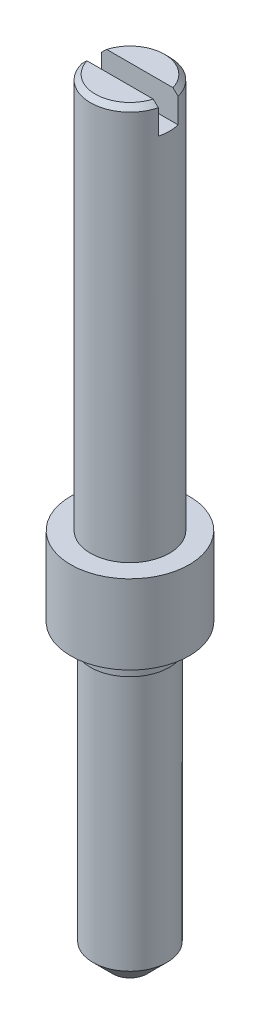
ISO-10303-21;
HEADER;
FILE_DESCRIPTION(('STEP AP214'),'2;1');
FILE_NAME('part.step','',(''),(''),'','','');
FILE_SCHEMA(('AUTOMOTIVE_DESIGN { 1 0 10303 214 1 1 1 1 }'));
ENDSEC;
DATA;
#1=APPLICATION_CONTEXT('core data for automotive mechanical design processes');
#2=APPLICATION_PROTOCOL_DEFINITION('international standard','automotive_design',2000,#1);
#3=PRODUCT_CONTEXT('',#1,'mechanical');
#4=PRODUCT('Part','Part','',(#3));
#5=PRODUCT_RELATED_PRODUCT_CATEGORY('part','',(#4));
#6=PRODUCT_DEFINITION_FORMATION('','',#4);
#7=PRODUCT_DEFINITION_CONTEXT('part definition',#1,'design');
#8=PRODUCT_DEFINITION('design','',#6,#7);
#9=PRODUCT_DEFINITION_SHAPE('','',#8);
#10=(LENGTH_UNIT() NAMED_UNIT(*) SI_UNIT(.MILLI.,.METRE.));
#11=(NAMED_UNIT(*) PLANE_ANGLE_UNIT() SI_UNIT($,.RADIAN.));
#12=(NAMED_UNIT(*) SI_UNIT($,.STERADIAN.) SOLID_ANGLE_UNIT());
#13=UNCERTAINTY_MEASURE_WITH_UNIT(LENGTH_MEASURE(1.E-05),#10,'distance_accuracy_value','');
#14=(GEOMETRIC_REPRESENTATION_CONTEXT(3) GLOBAL_UNCERTAINTY_ASSIGNED_CONTEXT((#13)) GLOBAL_UNIT_ASSIGNED_CONTEXT((#10,
#11,#12)) REPRESENTATION_CONTEXT('',''));
#15=CARTESIAN_POINT('',(0.,0.,0.));
#16=DIRECTION('',(0.,0.,1.));
#17=DIRECTION('',(1.,0.,0.));
#18=AXIS2_PLACEMENT_3D('',#15,#16,#17);
#19=CARTESIAN_POINT('',(0.,-1.,0.));
#20=DIRECTION('',(0.,-1.,0.));
#21=DIRECTION('',(0.,0.,-1.));
#22=AXIS2_PLACEMENT_3D('',#19,#20,#21);
#23=PLANE('',#22);
#24=CARTESIAN_POINT('',(0.,-1.,0.));
#25=DIRECTION('',(0.,-1.,0.));
#26=DIRECTION('',(0.,0.,-1.));
#27=AXIS2_PLACEMENT_3D('',#24,#25,#26);
#28=CIRCLE('',#27,2.);
#29=CARTESIAN_POINT('',(0.,-1.,-2.));
#30=VERTEX_POINT('',#29);
#31=EDGE_CURVE('E321',#30,#30,#28,.T.);
#32=ORIENTED_EDGE('',*,*,#31,.T.);
#33=EDGE_LOOP('',(#32));
#34=FACE_BOUND('',#33,.T.);
#35=CARTESIAN_POINT('',(0.,-1.,0.));
#36=DIRECTION('',(0.,-1.,0.));
#37=DIRECTION('',(0.,0.,-1.));
#38=AXIS2_PLACEMENT_3D('',#35,#36,#37);
#39=CIRCLE('',#38,1.875);
#40=CARTESIAN_POINT('',(0.,-1.,-1.875));
#41=VERTEX_POINT('',#40);
#42=EDGE_CURVE('E325',#41,#41,#39,.T.);
#43=ORIENTED_EDGE('',*,*,#42,.F.);
#44=EDGE_LOOP('',(#43));
#45=FACE_BOUND('',#44,.T.);
#46=ADVANCED_FACE('F34',(#34,#45),#23,.T.);
#47=CARTESIAN_POINT('',(0.,0.,0.));
#48=DIRECTION('',(0.,1.,0.));
#49=DIRECTION('',(0.,0.,1.));
#50=AXIS2_PLACEMENT_3D('',#47,#48,#49);
#51=PLANE('',#50);
#52=CARTESIAN_POINT('',(0.,0.,0.));
#53=DIRECTION('',(0.,1.,0.));
#54=DIRECTION('',(0.,0.,1.));
#55=AXIS2_PLACEMENT_3D('',#52,#53,#54);
#56=CIRCLE('',#55,3.);
#57=CARTESIAN_POINT('',(0.,0.,3.));
#58=VERTEX_POINT('',#57);
#59=EDGE_CURVE('E121',#58,#58,#56,.T.);
#60=ORIENTED_EDGE('',*,*,#59,.F.);
#61=EDGE_LOOP('',(#60));
#62=FACE_BOUND('',#61,.T.);
#63=CARTESIAN_POINT('',(0.,0.,0.));
#64=DIRECTION('',(0.,1.,0.));
#65=DIRECTION('',(0.,0.,1.));
#66=AXIS2_PLACEMENT_3D('',#63,#64,#65);
#67=CIRCLE('',#66,2.);
#68=CARTESIAN_POINT('',(0.,0.,2.));
#69=VERTEX_POINT('',#68);
#70=EDGE_CURVE('E304',#69,#69,#67,.F.);
#71=ORIENTED_EDGE('',*,*,#70,.F.);
#72=EDGE_LOOP('',(#71));
#73=FACE_BOUND('',#72,.T.);
#74=ADVANCED_FACE('F170',(#62,#73),#51,.F.);
#75=CARTESIAN_POINT('',(0.,24.,0.));
#76=DIRECTION('',(0.,1.,0.));
#77=DIRECTION('',(0.,0.,1.));
#78=AXIS2_PLACEMENT_3D('',#75,#76,#77);
#79=PLANE('',#78);
#80=DIRECTION('',(-1.,0.,0.));
#81=VECTOR('',#80,1.);
#82=CARTESIAN_POINT('',(-1.93649167310371,24.,-0.5));
#83=LINE('',#82,#81);
#84=CARTESIAN_POINT('',(1.67705098312484,24.,-0.5));
#85=VERTEX_POINT('',#84);
#86=CARTESIAN_POINT('',(-1.67705098312484,24.,-0.5));
#87=VERTEX_POINT('',#86);
#88=EDGE_CURVE('E104',#85,#87,#83,.T.);
#89=ORIENTED_EDGE('',*,*,#88,.F.);
#90=CARTESIAN_POINT('',(0.,24.,0.));
#91=DIRECTION('',(0.,1.,0.));
#92=DIRECTION('',(0.,0.,1.));
#93=AXIS2_PLACEMENT_3D('',#90,#91,#92);
#94=CIRCLE('',#93,1.75);
#95=EDGE_CURVE('E131',#85,#87,#94,.T.);
#96=ORIENTED_EDGE('',*,*,#95,.T.);
#97=EDGE_LOOP('',(#89,#96));
#98=FACE_BOUND('',#97,.T.);
#99=ADVANCED_FACE('F161',(#98),#79,.T.);
#100=CARTESIAN_POINT('',(0.,24.,0.));
#101=DIRECTION('',(0.,-1.,0.));
#102=DIRECTION('',(0.,0.,-1.));
#103=AXIS2_PLACEMENT_3D('',#100,#101,#102);
#104=CONICAL_SURFACE('',#103,1.75,0.785398163397452);
#105=CARTESIAN_POINT('',(4.26531787754271,21.4554759755608,-0.5));
#106=CARTESIAN_POINT('',(4.15151518624152,21.5685024584271,-0.5));
#107=CARTESIAN_POINT('',(4.03768402372244,21.6815002934528,-0.5));
#108=CARTESIAN_POINT('',(3.80991975587555,21.9074387740765,-0.5));
#109=CARTESIAN_POINT('',(3.69598663470435,22.0203794037019,-0.5));
#110=CARTESIAN_POINT('',(3.46754857933057,22.2466242081267,-0.5));
#111=CARTESIAN_POINT('',(3.3530432257615,22.359927959685,-0.5));
#112=CARTESIAN_POINT('',(3.12391530891066,22.5863714174036,-0.5));
#113=CARTESIAN_POINT('',(3.00929277333081,22.699511151607,-0.5));
#114=CARTESIAN_POINT('',(2.70997074398026,22.9944738741391,-0.5));
#115=CARTESIAN_POINT('',(2.52512281691123,23.1761465743836,-0.5));
#116=CARTESIAN_POINT('',(2.24709863471769,23.4480252609569,-0.5));
#117=CARTESIAN_POINT('',(2.15426369332282,23.5385801504923,-0.5));
#118=CARTESIAN_POINT('',(1.96826703440717,23.7193378604755,-0.5));
#119=CARTESIAN_POINT('',(1.87510534627139,23.8095407111157,-0.5));
#120=CARTESIAN_POINT('',(1.68864712306421,23.9890633836891,-0.5));
#121=CARTESIAN_POINT('',(1.59535259608439,24.0783852904116,-0.5));
#122=CARTESIAN_POINT('',(1.40793266669689,24.256220208321,-0.5));
#123=CARTESIAN_POINT('',(1.31380699992914,24.3447329424718,-0.5));
#124=CARTESIAN_POINT('',(1.17161181625573,24.4762812718874,-0.5));
#125=CARTESIAN_POINT('',(1.12407958973265,24.5198968574824,-0.5));
#126=CARTESIAN_POINT('',(1.02851175250693,24.6065721259345,-0.5));
#127=CARTESIAN_POINT('',(0.980476157653118,24.6496318261994,-0.5));
#128=CARTESIAN_POINT('',(0.883705860067149,24.7349073268237,-0.5));
#129=CARTESIAN_POINT('',(0.834971543685559,24.7771235648337,-0.5));
#130=CARTESIAN_POINT('',(0.73642483553698,24.8602743358567,-0.5));
#131=CARTESIAN_POINT('',(0.686612687192244,24.9012091532655,-0.5));
#132=CARTESIAN_POINT('',(0.617031379774116,24.9559000782556,-0.5));
#133=CARTESIAN_POINT('',(0.598008489381538,24.9706041090213,-0.5));
#134=CARTESIAN_POINT('',(0.5596648389008,24.9996222045299,-0.5));
#135=CARTESIAN_POINT('',(0.540344059316314,25.0139362435775,-0.5));
#136=CARTESIAN_POINT('',(0.501292890607584,25.0421082406535,-0.5));
#137=CARTESIAN_POINT('',(0.481561553810242,25.0559648932016,-0.5));
#138=CARTESIAN_POINT('',(0.441659654755156,25.0830290820533,-0.5));
#139=CARTESIAN_POINT('',(0.421489104550932,25.096236636138,-0.5));
#140=CARTESIAN_POINT('',(0.361591838721084,25.1337311733941,-0.5));
#141=CARTESIAN_POINT('',(0.321138914284564,25.1568871627387,-0.5));
#142=CARTESIAN_POINT('',(0.237575443534113,25.1976166146513,-0.5));
#143=CARTESIAN_POINT('',(0.194480378251023,25.2152194619088,-0.5));
#144=CARTESIAN_POINT('',(0.121079633871168,25.2362844237364,-0.5));
#145=CARTESIAN_POINT('',(0.0916123317298164,25.2425430717708,-0.5));
#146=CARTESIAN_POINT('',(0.0321049951851632,25.2498330261306,-0.5));
#147=CARTESIAN_POINT('',(0.00206744515655411,25.2508833375786,-0.5));
#148=CARTESIAN_POINT('',(-0.0576608042596576,25.247572541417,-0.5));
#149=CARTESIAN_POINT('',(-0.0873517863687083,25.2432162089202,-0.5));
#150=CARTESIAN_POINT('',(-0.145788203831575,25.2299662871562,-0.5));
#151=CARTESIAN_POINT('',(-0.174528639245886,25.2210518369402,-0.5));
#152=CARTESIAN_POINT('',(-0.238412926586048,25.1970666040295,-0.5));
#153=CARTESIAN_POINT('',(-0.273161984222417,25.1809793985483,-0.5));
#154=CARTESIAN_POINT('',(-0.340960261675686,25.1455019051203,-0.5));
#155=CARTESIAN_POINT('',(-0.374005278452894,25.1261039151618,-0.5));
#156=CARTESIAN_POINT('',(-0.439015355748992,25.0850972066781,-0.5));
#157=CARTESIAN_POINT('',(-0.470970621936341,25.0634731994436,-0.5));
#158=CARTESIAN_POINT('',(-0.533867344579049,25.0188881554988,-0.5));
#159=CARTESIAN_POINT('',(-0.564809910471793,24.9959286640688,-0.5));
#160=CARTESIAN_POINT('',(-0.62966785545866,24.9462615095642,-0.5));
#161=CARTESIAN_POINT('',(-0.663492122241673,24.9194355862842,-0.5));
#162=CARTESIAN_POINT('',(-0.730495978426937,24.8649878852663,-0.5));
#163=CARTESIAN_POINT('',(-0.763675494359953,24.8373660177108,-0.5));
#164=CARTESIAN_POINT('',(-0.862532606769384,24.7536472277128,-0.5));
#165=CARTESIAN_POINT('',(-0.927502903613756,24.6967175656545,-0.5));
#166=CARTESIAN_POINT('',(-1.05644705081713,24.58155844743,-0.5));
#167=CARTESIAN_POINT('',(-1.12041922888757,24.5233271399563,-0.5));
#168=CARTESIAN_POINT('',(-1.24764894408228,24.406119053802,-0.5));
#169=CARTESIAN_POINT('',(-1.31090664244247,24.3471424499449,-0.5));
#170=CARTESIAN_POINT('',(-1.43666912584221,24.2289607375214,-0.5));
#171=CARTESIAN_POINT('',(-1.49917602226856,24.1697578692336,-0.5));
#172=CARTESIAN_POINT('',(-1.62386630718498,24.0510054220652,-0.5));
#173=CARTESIAN_POINT('',(-1.68604967646786,23.9914558230347,-0.5));
#174=CARTESIAN_POINT('',(-1.87214706195446,23.8125379153891,-0.5));
#175=CARTESIAN_POINT('',(-1.99570976552237,23.6928045211509,-0.5));
#176=CARTESIAN_POINT('',(-2.29878980100316,23.3978235660328,-0.5));
#177=CARTESIAN_POINT('',(-2.47800996072874,23.2222713689718,-0.5));
#178=CARTESIAN_POINT('',(-2.83592222262505,22.8705227679865,-0.5));
#179=CARTESIAN_POINT('',(-3.01461414948333,22.6943261859514,-0.5));
#180=CARTESIAN_POINT('',(-3.37212767666048,22.3411188323872,-0.5));
#181=CARTESIAN_POINT('',(-3.5509483671104,22.1641071403978,-0.5));
#182=CARTESIAN_POINT('',(-3.90830424909201,21.8099079043485,-0.5));
#183=CARTESIAN_POINT('',(-4.08683951264414,21.6327204329667,-0.5));
#184=CARTESIAN_POINT('',(-4.26531787754271,21.4554759755608,-0.5));
#185=B_SPLINE_CURVE_WITH_KNOTS('',3,(#105,#106,#107,#108,#109,#110,#111,#112,#113,#114,#115,
#116,#117,#118,#119,#120,#121,#122,#123,#124,#125,#126,#127,#128,#129,#130,#131,#132,#133,#134,
#135,#136,#137,#138,#139,#140,#141,#142,#143,#144,#145,#146,#147,#148,#149,#150,#151,#152,#153,
#154,#155,#156,#157,#158,#159,#160,#161,#162,#163,#164,#165,#166,#167,#168,#169,#170,#171,#172,
#173,#174,#175,#176,#177,#178,#179,#180,#181,#182,#183,#184),.UNSPECIFIED.,.F.,.F.,(4,2,2,2,2,2,
2,2,2,2,2,2,2,2,2,2,2,2,2,2,2,2,2,2,2,2,2,2,2,2,2,2,2,2,2,2,2,2,2,4),(0.,0.481180169422649,
0.96245664384572,1.44571932312751,1.92888630056495,2.7064208367224,3.09547898630383,
3.48450300104498,3.87198061772441,4.25958626871581,4.4531157290629,4.64663911423027,
4.84005933088105,5.03343631142798,5.10556221008413,5.17769284946248,5.25001413936443,
5.32233344701758,5.46197212534036,5.60085899952463,5.6908530257277,5.78051842252886,
5.87010468376162,5.96010467028345,6.07468367164426,6.1895329493713,6.30523160738076,
6.4207989561512,6.55029326590066,6.67980224598345,6.93891905595021,7.19843136848874,
7.45788389751567,7.71616284228622,7.97445694950652,8.4906263036461,9.24324978173529,
9.99609995285635,10.7509439234449,11.5055508520952),.UNSPECIFIED.);
#186=CARTESIAN_POINT('',(1.93649167310371,23.75,-0.5));
#187=VERTEX_POINT('',#186);
#188=EDGE_CURVE('E303',#187,#85,#185,.T.);
#189=ORIENTED_EDGE('',*,*,#188,.F.);
#190=CARTESIAN_POINT('',(0.,23.75,0.));
#191=DIRECTION('',(0.,1.,0.));
#192=DIRECTION('',(0.,0.,1.));
#193=AXIS2_PLACEMENT_3D('',#190,#191,#192);
#194=CIRCLE('',#193,2.);
#195=CARTESIAN_POINT('',(-1.93649167310371,23.75,-0.5));
#196=VERTEX_POINT('',#195);
#197=EDGE_CURVE('E133',#196,#187,#194,.F.);
#198=ORIENTED_EDGE('',*,*,#197,.F.);
#199=EDGE_CURVE('E57',#87,#196,#185,.T.);
#200=ORIENTED_EDGE('',*,*,#199,.F.);
#201=ORIENTED_EDGE('',*,*,#95,.F.);
#202=EDGE_LOOP('',(#189,#198,#200,#201));
#203=FACE_BOUND('',#202,.T.);
#204=ADVANCED_FACE('F168',(#203),#104,.T.);
#205=CARTESIAN_POINT('',(0.,4.,0.));
#206=DIRECTION('',(0.,1.,0.));
#207=DIRECTION('',(0.,0.,1.));
#208=AXIS2_PLACEMENT_3D('',#205,#206,#207);
#209=PLANE('',#208);
#210=CARTESIAN_POINT('',(0.,4.,0.));
#211=DIRECTION('',(0.,1.,0.));
#212=DIRECTION('',(0.,0.,1.));
#213=AXIS2_PLACEMENT_3D('',#210,#211,#212);
#214=CIRCLE('',#213,3.);
#215=CARTESIAN_POINT('',(0.,4.,3.));
#216=VERTEX_POINT('',#215);
#217=EDGE_CURVE('E123',#216,#216,#214,.T.);
#218=ORIENTED_EDGE('',*,*,#217,.T.);
#219=EDGE_LOOP('',(#218));
#220=FACE_BOUND('',#219,.T.);
#221=CARTESIAN_POINT('',(0.,4.,0.));
#222=DIRECTION('',(0.,1.,0.));
#223=DIRECTION('',(0.,0.,1.));
#224=AXIS2_PLACEMENT_3D('',#221,#222,#223);
#225=CIRCLE('',#224,2.);
#226=CARTESIAN_POINT('',(0.,4.,2.));
#227=VERTEX_POINT('',#226);
#228=EDGE_CURVE('E118',#227,#227,#225,.T.);
#229=ORIENTED_EDGE('',*,*,#228,.F.);
#230=EDGE_LOOP('',(#229));
#231=FACE_BOUND('',#230,.T.);
#232=ADVANCED_FACE('F165',(#220,#231),#209,.T.);
#233=CARTESIAN_POINT('',(0.,4.,0.));
#234=DIRECTION('',(0.,-1.,0.));
#235=DIRECTION('',(0.,0.,-1.));
#236=AXIS2_PLACEMENT_3D('',#233,#234,#235);
#237=CYLINDRICAL_SURFACE('',#236,3.);
#238=ORIENTED_EDGE('',*,*,#217,.F.);
#239=EDGE_LOOP('',(#238));
#240=FACE_BOUND('',#239,.T.);
#241=ORIENTED_EDGE('',*,*,#59,.T.);
#242=EDGE_LOOP('',(#241));
#243=FACE_BOUND('',#242,.T.);
#244=ADVANCED_FACE('F164',(#240,#243),#237,.T.);
#245=CARTESIAN_POINT('',(0.,24.,0.));
#246=DIRECTION('',(0.,-1.,0.));
#247=DIRECTION('',(0.,0.,-1.));
#248=AXIS2_PLACEMENT_3D('',#245,#246,#247);
#249=CYLINDRICAL_SURFACE('',#248,2.);
#250=ORIENTED_EDGE('',*,*,#197,.T.);
#251=DIRECTION('',(0.,1.,0.));
#252=VECTOR('',#251,1.);
#253=CARTESIAN_POINT('',(1.93649167310371,22.5,-0.5));
#254=LINE('',#253,#252);
#255=CARTESIAN_POINT('',(1.93649167310371,22.5,-0.5));
#256=VERTEX_POINT('',#255);
#257=EDGE_CURVE('E113',#256,#187,#254,.T.);
#258=ORIENTED_EDGE('',*,*,#257,.F.);
#259=CARTESIAN_POINT('',(0.,22.5,0.));
#260=DIRECTION('',(0.,1.,0.));
#261=DIRECTION('',(0.,0.,1.));
#262=AXIS2_PLACEMENT_3D('',#259,#260,#261);
#263=CIRCLE('',#262,2.);
#264=CARTESIAN_POINT('',(1.93649167310371,22.5,0.5));
#265=VERTEX_POINT('',#264);
#266=EDGE_CURVE('E95',#265,#256,#263,.T.);
#267=ORIENTED_EDGE('',*,*,#266,.F.);
#268=DIRECTION('',(0.,1.,0.));
#269=VECTOR('',#268,1.);
#270=CARTESIAN_POINT('',(1.93649167310371,22.5,0.5));
#271=LINE('',#270,#269);
#272=CARTESIAN_POINT('',(1.93649167310371,23.75,0.5));
#273=VERTEX_POINT('',#272);
#274=EDGE_CURVE('E92',#265,#273,#271,.T.);
#275=ORIENTED_EDGE('',*,*,#274,.T.);
#276=CARTESIAN_POINT('',(-1.93649167310371,23.75,0.5));
#277=VERTEX_POINT('',#276);
#278=EDGE_CURVE('E111',#273,#277,#194,.F.);
#279=ORIENTED_EDGE('',*,*,#278,.T.);
#280=DIRECTION('',(0.,1.,0.));
#281=VECTOR('',#280,1.);
#282=CARTESIAN_POINT('',(-1.93649167310371,22.5,0.5));
#283=LINE('',#282,#281);
#284=CARTESIAN_POINT('',(-1.93649167310371,22.5,0.5));
#285=VERTEX_POINT('',#284);
#286=EDGE_CURVE('E89',#285,#277,#283,.T.);
#287=ORIENTED_EDGE('',*,*,#286,.F.);
#288=CARTESIAN_POINT('',(0.,22.5,0.));
#289=DIRECTION('',(0.,1.,0.));
#290=DIRECTION('',(0.,0.,1.));
#291=AXIS2_PLACEMENT_3D('',#288,#289,#290);
#292=CIRCLE('',#291,2.);
#293=CARTESIAN_POINT('',(-1.93649167310371,22.5,-0.5));
#294=VERTEX_POINT('',#293);
#295=EDGE_CURVE('E96',#294,#285,#292,.T.);
#296=ORIENTED_EDGE('',*,*,#295,.F.);
#297=DIRECTION('',(0.,1.,0.));
#298=VECTOR('',#297,1.);
#299=CARTESIAN_POINT('',(-1.93649167310371,22.5,-0.5));
#300=LINE('',#299,#298);
#301=EDGE_CURVE('E122',#294,#196,#300,.T.);
#302=ORIENTED_EDGE('',*,*,#301,.T.);
#303=EDGE_LOOP('',(#250,#258,#267,#275,#279,#287,#296,#302));
#304=FACE_BOUND('',#303,.T.);
#305=ORIENTED_EDGE('',*,*,#228,.T.);
#306=EDGE_LOOP('',(#305));
#307=FACE_BOUND('',#306,.T.);
#308=ADVANCED_FACE('F108',(#304,#307),#249,.T.);
#309=DIRECTION('',(1.,0.,0.));
#310=VECTOR('',#309,1.);
#311=CARTESIAN_POINT('',(-1.93649167310371,24.,0.5));
#312=LINE('',#311,#310);
#313=CARTESIAN_POINT('',(-1.67705098312484,24.,0.5));
#314=VERTEX_POINT('',#313);
#315=CARTESIAN_POINT('',(1.67705098312484,24.,0.5));
#316=VERTEX_POINT('',#315);
#317=EDGE_CURVE('E49',#314,#316,#312,.T.);
#318=ORIENTED_EDGE('',*,*,#317,.F.);
#319=EDGE_CURVE('E126',#314,#316,#94,.T.);
#320=ORIENTED_EDGE('',*,*,#319,.T.);
#321=EDGE_LOOP('',(#318,#320));
#322=FACE_BOUND('',#321,.T.);
#323=ADVANCED_FACE('F157',(#322),#79,.T.);
#324=CARTESIAN_POINT('',(-4.26531787754271,21.4554759755608,0.5));
#325=CARTESIAN_POINT('',(-4.15151518624152,21.5685024584271,0.5));
#326=CARTESIAN_POINT('',(-4.03768402372244,21.6815002934528,0.5));
#327=CARTESIAN_POINT('',(-3.80991975587555,21.9074387740765,0.5));
#328=CARTESIAN_POINT('',(-3.69598663470435,22.0203794037019,0.5));
#329=CARTESIAN_POINT('',(-3.46754857933057,22.2466242081267,0.5));
#330=CARTESIAN_POINT('',(-3.3530432257615,22.359927959685,0.5));
#331=CARTESIAN_POINT('',(-3.12391530891066,22.5863714174036,0.5));
#332=CARTESIAN_POINT('',(-3.00929277333081,22.699511151607,0.5));
#333=CARTESIAN_POINT('',(-2.70997074398026,22.9944738741391,0.5));
#334=CARTESIAN_POINT('',(-2.52512281691123,23.1761465743836,0.5));
#335=CARTESIAN_POINT('',(-2.24709863471769,23.4480252609569,0.5));
#336=CARTESIAN_POINT('',(-2.15426369332282,23.5385801504923,0.5));
#337=CARTESIAN_POINT('',(-1.96826703440717,23.7193378604755,0.5));
#338=CARTESIAN_POINT('',(-1.87510534627139,23.8095407111157,0.5));
#339=CARTESIAN_POINT('',(-1.68864712306421,23.9890633836891,0.5));
#340=CARTESIAN_POINT('',(-1.59535259608439,24.0783852904116,0.5));
#341=CARTESIAN_POINT('',(-1.40793266669689,24.256220208321,0.5));
#342=CARTESIAN_POINT('',(-1.31380699992914,24.3447329424718,0.5));
#343=CARTESIAN_POINT('',(-1.17161181625573,24.4762812718874,0.5));
#344=CARTESIAN_POINT('',(-1.12407958973265,24.5198968574824,0.5));
#345=CARTESIAN_POINT('',(-1.02851175250693,24.6065721259345,0.5));
#346=CARTESIAN_POINT('',(-0.980476157653118,24.6496318261994,0.5));
#347=CARTESIAN_POINT('',(-0.883705860067149,24.7349073268237,0.5));
#348=CARTESIAN_POINT('',(-0.834971543685559,24.7771235648337,0.5));
#349=CARTESIAN_POINT('',(-0.73642483553698,24.8602743358567,0.5));
#350=CARTESIAN_POINT('',(-0.686612687192244,24.9012091532655,0.5));
#351=CARTESIAN_POINT('',(-0.617031379774116,24.9559000782556,0.5));
#352=CARTESIAN_POINT('',(-0.598008489381538,24.9706041090213,0.5));
#353=CARTESIAN_POINT('',(-0.5596648389008,24.9996222045299,0.5));
#354=CARTESIAN_POINT('',(-0.540344059316314,25.0139362435775,0.5));
#355=CARTESIAN_POINT('',(-0.501292890607584,25.0421082406535,0.5));
#356=CARTESIAN_POINT('',(-0.481561553810242,25.0559648932016,0.5));
#357=CARTESIAN_POINT('',(-0.441659654755156,25.0830290820533,0.5));
#358=CARTESIAN_POINT('',(-0.421489104550932,25.096236636138,0.5));
#359=CARTESIAN_POINT('',(-0.361591838721084,25.1337311733941,0.5));
#360=CARTESIAN_POINT('',(-0.321138914284564,25.1568871627387,0.5));
#361=CARTESIAN_POINT('',(-0.237575443534113,25.1976166146513,0.5));
#362=CARTESIAN_POINT('',(-0.194480378251023,25.2152194619088,0.5));
#363=CARTESIAN_POINT('',(-0.121079633871168,25.2362844237364,0.5));
#364=CARTESIAN_POINT('',(-0.0916123317298164,25.2425430717708,0.5));
#365=CARTESIAN_POINT('',(-0.0321049951851632,25.2498330261306,0.5));
#366=CARTESIAN_POINT('',(-0.00206744515655411,25.2508833375786,0.5));
#367=CARTESIAN_POINT('',(0.0576608042596576,25.247572541417,0.5));
#368=CARTESIAN_POINT('',(0.0873517863687083,25.2432162089202,0.5));
#369=CARTESIAN_POINT('',(0.145788203831575,25.2299662871562,0.5));
#370=CARTESIAN_POINT('',(0.174528639245886,25.2210518369402,0.5));
#371=CARTESIAN_POINT('',(0.238412926586048,25.1970666040295,0.5));
#372=CARTESIAN_POINT('',(0.273161984222417,25.1809793985483,0.5));
#373=CARTESIAN_POINT('',(0.340960261675686,25.1455019051203,0.5));
#374=CARTESIAN_POINT('',(0.374005278452894,25.1261039151618,0.5));
#375=CARTESIAN_POINT('',(0.439015355748992,25.0850972066781,0.5));
#376=CARTESIAN_POINT('',(0.470970621936341,25.0634731994436,0.5));
#377=CARTESIAN_POINT('',(0.533867344579049,25.0188881554988,0.5));
#378=CARTESIAN_POINT('',(0.564809910471793,24.9959286640688,0.5));
#379=CARTESIAN_POINT('',(0.62966785545866,24.9462615095642,0.5));
#380=CARTESIAN_POINT('',(0.663492122241673,24.9194355862842,0.5));
#381=CARTESIAN_POINT('',(0.730495978426937,24.8649878852663,0.5));
#382=CARTESIAN_POINT('',(0.763675494359953,24.8373660177108,0.5));
#383=CARTESIAN_POINT('',(0.862532606769384,24.7536472277128,0.5));
#384=CARTESIAN_POINT('',(0.927502903613756,24.6967175656545,0.5));
#385=CARTESIAN_POINT('',(1.05644705081713,24.58155844743,0.5));
#386=CARTESIAN_POINT('',(1.12041922888757,24.5233271399563,0.5));
#387=CARTESIAN_POINT('',(1.24764894408228,24.406119053802,0.5));
#388=CARTESIAN_POINT('',(1.31090664244247,24.3471424499449,0.5));
#389=CARTESIAN_POINT('',(1.43666912584221,24.2289607375214,0.5));
#390=CARTESIAN_POINT('',(1.49917602226856,24.1697578692336,0.5));
#391=CARTESIAN_POINT('',(1.62386630718498,24.0510054220652,0.5));
#392=CARTESIAN_POINT('',(1.68604967646786,23.9914558230347,0.5));
#393=CARTESIAN_POINT('',(1.87214706195446,23.8125379153891,0.5));
#394=CARTESIAN_POINT('',(1.99570976552237,23.6928045211509,0.5));
#395=CARTESIAN_POINT('',(2.29878980100316,23.3978235660328,0.5));
#396=CARTESIAN_POINT('',(2.47800996072874,23.2222713689718,0.5));
#397=CARTESIAN_POINT('',(2.83592222262505,22.8705227679865,0.5));
#398=CARTESIAN_POINT('',(3.01461414948333,22.6943261859514,0.5));
#399=CARTESIAN_POINT('',(3.37212767666048,22.3411188323872,0.5));
#400=CARTESIAN_POINT('',(3.5509483671104,22.1641071403978,0.5));
#401=CARTESIAN_POINT('',(3.90830424909201,21.8099079043485,0.5));
#402=CARTESIAN_POINT('',(4.08683951264414,21.6327204329667,0.5));
#403=CARTESIAN_POINT('',(4.26531787754271,21.4554759755608,0.5));
#404=B_SPLINE_CURVE_WITH_KNOTS('',3,(#324,#325,#326,#327,#328,#329,#330,#331,#332,#333,#334,
#335,#336,#337,#338,#339,#340,#341,#342,#343,#344,#345,#346,#347,#348,#349,#350,#351,#352,#353,
#354,#355,#356,#357,#358,#359,#360,#361,#362,#363,#364,#365,#366,#367,#368,#369,#370,#371,#372,
#373,#374,#375,#376,#377,#378,#379,#380,#381,#382,#383,#384,#385,#386,#387,#388,#389,#390,#391,
#392,#393,#394,#395,#396,#397,#398,#399,#400,#401,#402,#403),.UNSPECIFIED.,.F.,.F.,(4,2,2,2,2,2,
2,2,2,2,2,2,2,2,2,2,2,2,2,2,2,2,2,2,2,2,2,2,2,2,2,2,2,2,2,2,2,2,2,4),(0.,0.481180169422649,
0.96245664384572,1.44571932312751,1.92888630056495,2.7064208367224,3.09547898630383,
3.48450300104498,3.87198061772441,4.25958626871581,4.4531157290629,4.64663911423027,
4.84005933088105,5.03343631142798,5.10556221008413,5.17769284946248,5.25001413936443,
5.32233344701758,5.46197212534036,5.60085899952463,5.6908530257277,5.78051842252886,
5.87010468376162,5.96010467028345,6.07468367164426,6.1895329493713,6.30523160738076,
6.4207989561512,6.55029326590066,6.67980224598345,6.93891905595021,7.19843136848874,
7.45788389751567,7.71616284228622,7.97445694950652,8.4906263036461,9.24324978173529,
9.99609995285635,10.7509439234449,11.5055508520952),.UNSPECIFIED.);
#405=EDGE_CURVE('E141',#277,#314,#404,.T.);
#406=ORIENTED_EDGE('',*,*,#405,.F.);
#407=ORIENTED_EDGE('',*,*,#278,.F.);
#408=EDGE_CURVE('E134',#316,#273,#404,.T.);
#409=ORIENTED_EDGE('',*,*,#408,.F.);
#410=ORIENTED_EDGE('',*,*,#319,.F.);
#411=EDGE_LOOP('',(#406,#407,#409,#410));
#412=FACE_BOUND('',#411,.T.);
#413=ADVANCED_FACE('F148',(#412),#104,.T.);
#414=CARTESIAN_POINT('',(-1.93649167310371,22.5,-0.5));
#415=DIRECTION('',(0.,0.,-1.));
#416=DIRECTION('',(-1.,0.,0.));
#417=AXIS2_PLACEMENT_3D('',#414,#415,#416);
#418=PLANE('',#417);
#419=ORIENTED_EDGE('',*,*,#188,.T.);
#420=ORIENTED_EDGE('',*,*,#88,.T.);
#421=ORIENTED_EDGE('',*,*,#199,.T.);
#422=ORIENTED_EDGE('',*,*,#301,.F.);
#423=DIRECTION('',(-1.,0.,0.));
#424=VECTOR('',#423,1.);
#425=CARTESIAN_POINT('',(-1.93649167310371,22.5,-0.5));
#426=LINE('',#425,#424);
#427=EDGE_CURVE('E102',#256,#294,#426,.T.);
#428=ORIENTED_EDGE('',*,*,#427,.F.);
#429=ORIENTED_EDGE('',*,*,#257,.T.);
#430=EDGE_LOOP('',(#419,#420,#421,#422,#428,#429));
#431=FACE_BOUND('',#430,.T.);
#432=ADVANCED_FACE('F154',(#431),#418,.F.);
#433=CARTESIAN_POINT('',(-1.93649167310371,22.5,0.5));
#434=DIRECTION('',(0.,0.,1.));
#435=DIRECTION('',(1.,0.,0.));
#436=AXIS2_PLACEMENT_3D('',#433,#434,#435);
#437=PLANE('',#436);
#438=ORIENTED_EDGE('',*,*,#405,.T.);
#439=ORIENTED_EDGE('',*,*,#317,.T.);
#440=ORIENTED_EDGE('',*,*,#408,.T.);
#441=ORIENTED_EDGE('',*,*,#274,.F.);
#442=DIRECTION('',(1.,0.,0.));
#443=VECTOR('',#442,1.);
#444=CARTESIAN_POINT('',(-1.93649167310371,22.5,0.5));
#445=LINE('',#444,#443);
#446=EDGE_CURVE('E85',#285,#265,#445,.T.);
#447=ORIENTED_EDGE('',*,*,#446,.F.);
#448=ORIENTED_EDGE('',*,*,#286,.T.);
#449=EDGE_LOOP('',(#438,#439,#440,#441,#447,#448));
#450=FACE_BOUND('',#449,.T.);
#451=ADVANCED_FACE('F87',(#450),#437,.F.);
#452=CARTESIAN_POINT('',(0.,22.5,0.));
#453=DIRECTION('',(0.,1.,0.));
#454=DIRECTION('',(0.,0.,1.));
#455=AXIS2_PLACEMENT_3D('',#452,#453,#454);
#456=PLANE('',#455);
#457=ORIENTED_EDGE('',*,*,#295,.T.);
#458=ORIENTED_EDGE('',*,*,#446,.T.);
#459=ORIENTED_EDGE('',*,*,#266,.T.);
#460=ORIENTED_EDGE('',*,*,#427,.T.);
#461=EDGE_LOOP('',(#457,#458,#459,#460));
#462=FACE_BOUND('',#461,.T.);
#463=ADVANCED_FACE('F100',(#462),#456,.T.);
#464=CARTESIAN_POINT('',(0.,-1.,0.));
#465=DIRECTION('',(0.,1.,0.));
#466=DIRECTION('',(0.,0.,1.));
#467=AXIS2_PLACEMENT_3D('',#464,#465,#466);
#468=CYLINDRICAL_SURFACE('',#467,2.);
#469=ORIENTED_EDGE('',*,*,#31,.F.);
#470=EDGE_LOOP('',(#469));
#471=FACE_BOUND('',#470,.T.);
#472=ORIENTED_EDGE('',*,*,#70,.T.);
#473=EDGE_LOOP('',(#472));
#474=FACE_BOUND('',#473,.T.);
#475=ADVANCED_FACE('F190',(#471,#474),#468,.T.);
#476=CARTESIAN_POINT('',(0.,-15.,0.));
#477=DIRECTION('',(0.,1.,0.));
#478=DIRECTION('',(0.,0.,1.));
#479=AXIS2_PLACEMENT_3D('',#476,#477,#478);
#480=CYLINDRICAL_SURFACE('',#479,1.875);
#481=CARTESIAN_POINT('',(0.,-14.,0.));
#482=DIRECTION('',(0.,-1.,0.));
#483=DIRECTION('',(0.,0.,-1.));
#484=AXIS2_PLACEMENT_3D('',#481,#482,#483);
#485=CIRCLE('',#484,1.875);
#486=CARTESIAN_POINT('',(0.,-14.,-1.875));
#487=VERTEX_POINT('',#486);
#488=EDGE_CURVE('E11',#487,#487,#485,.F.);
#489=ORIENTED_EDGE('',*,*,#488,.T.);
#490=EDGE_LOOP('',(#489));
#491=FACE_BOUND('',#490,.T.);
#492=ORIENTED_EDGE('',*,*,#42,.T.);
#493=EDGE_LOOP('',(#492));
#494=FACE_BOUND('',#493,.T.);
#495=ADVANCED_FACE('F188',(#491,#494),#480,.T.);
#496=CARTESIAN_POINT('',(0.,-15.,0.));
#497=DIRECTION('',(0.,-1.,0.));
#498=DIRECTION('',(0.,0.,-1.));
#499=AXIS2_PLACEMENT_3D('',#496,#497,#498);
#500=PLANE('',#499);
#501=CARTESIAN_POINT('',(0.,-15.,0.));
#502=DIRECTION('',(0.,-1.,0.));
#503=DIRECTION('',(0.,0.,-1.));
#504=AXIS2_PLACEMENT_3D('',#501,#502,#503);
#505=CIRCLE('',#504,0.874999999999997);
#506=CARTESIAN_POINT('',(0.,-15.,-0.874999999999997));
#507=VERTEX_POINT('',#506);
#508=EDGE_CURVE('E42',#507,#507,#505,.T.);
#509=ORIENTED_EDGE('',*,*,#508,.T.);
#510=EDGE_LOOP('',(#509));
#511=FACE_BOUND('',#510,.T.);
#512=ADVANCED_FACE('F210',(#511),#500,.T.);
#513=CARTESIAN_POINT('',(0.,-15.,0.));
#514=DIRECTION('',(0.,1.,0.));
#515=DIRECTION('',(0.,0.,1.));
#516=AXIS2_PLACEMENT_3D('',#513,#514,#515);
#517=CONICAL_SURFACE('',#516,0.874999999999997,0.785398163397447);
#518=ORIENTED_EDGE('',*,*,#488,.F.);
#519=EDGE_LOOP('',(#518));
#520=FACE_BOUND('',#519,.T.);
#521=ORIENTED_EDGE('',*,*,#508,.F.);
#522=EDGE_LOOP('',(#521));
#523=FACE_BOUND('',#522,.T.);
#524=ADVANCED_FACE('F36',(#520,#523),#517,.T.);
#525=CLOSED_SHELL('',(#46,#74,#99,#204,#232,#244,#308,#323,#413,#432,#451,#463,#475,#495,#512,#524));
#526=MANIFOLD_SOLID_BREP('B2',#525);
#527=ADVANCED_BREP_SHAPE_REPRESENTATION('',(#18,#526),#14);
#528=SHAPE_DEFINITION_REPRESENTATION(#9,#527);
ENDSEC;
END-ISO-10303-21;
